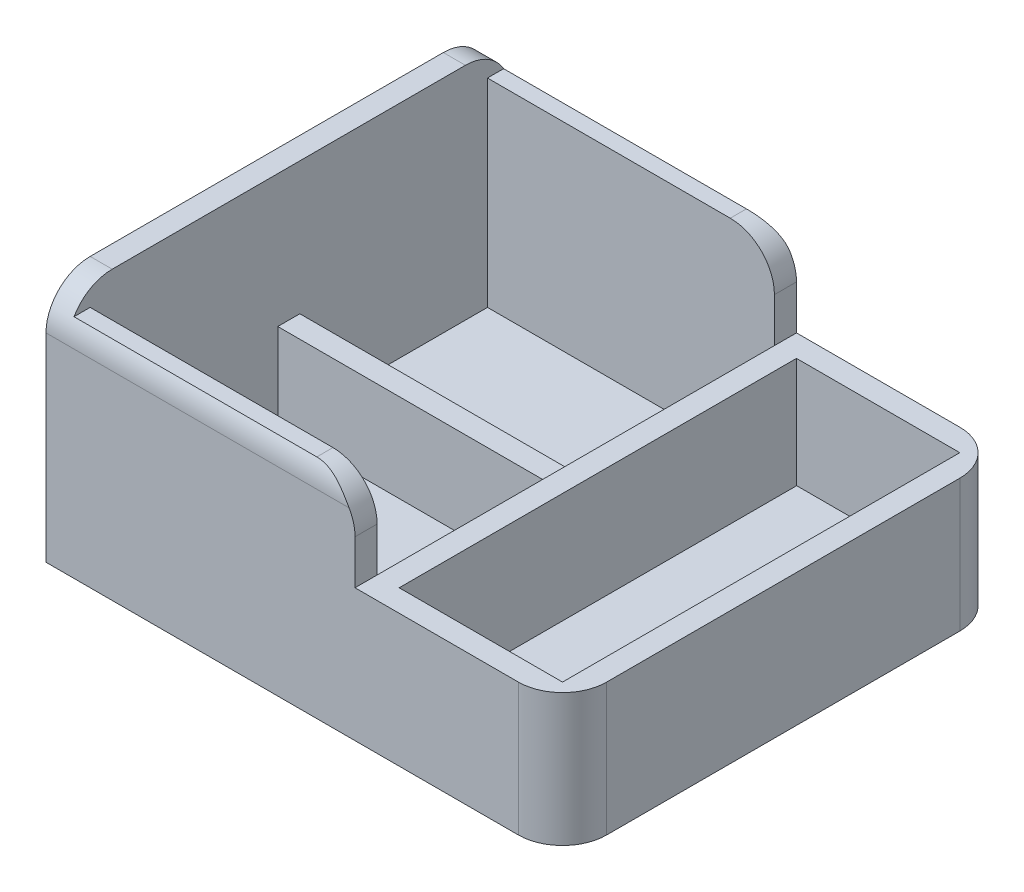
ISO-10303-21;
HEADER;
FILE_DESCRIPTION(('STEP AP214'),'2;1');
FILE_NAME('part.step','',(''),(''),'','','');
FILE_SCHEMA(('AUTOMOTIVE_DESIGN { 1 0 10303 214 1 1 1 1 }'));
ENDSEC;
DATA;
#1=APPLICATION_CONTEXT('core data for automotive mechanical design processes');
#2=APPLICATION_PROTOCOL_DEFINITION('international standard','automotive_design',2000,#1);
#3=PRODUCT_CONTEXT('',#1,'mechanical');
#4=PRODUCT('Part','Part','',(#3));
#5=PRODUCT_RELATED_PRODUCT_CATEGORY('part','',(#4));
#6=PRODUCT_DEFINITION_FORMATION('','',#4);
#7=PRODUCT_DEFINITION_CONTEXT('part definition',#1,'design');
#8=PRODUCT_DEFINITION('design','',#6,#7);
#9=PRODUCT_DEFINITION_SHAPE('','',#8);
#10=(LENGTH_UNIT() NAMED_UNIT(*) SI_UNIT(.MILLI.,.METRE.));
#11=(NAMED_UNIT(*) PLANE_ANGLE_UNIT() SI_UNIT($,.RADIAN.));
#12=(NAMED_UNIT(*) SI_UNIT($,.STERADIAN.) SOLID_ANGLE_UNIT());
#13=UNCERTAINTY_MEASURE_WITH_UNIT(LENGTH_MEASURE(1.E-05),#10,'distance_accuracy_value','');
#14=(GEOMETRIC_REPRESENTATION_CONTEXT(3) GLOBAL_UNCERTAINTY_ASSIGNED_CONTEXT((#13)) GLOBAL_UNIT_ASSIGNED_CONTEXT((#10,
#11,#12)) REPRESENTATION_CONTEXT('',''));
#15=CARTESIAN_POINT('',(0.,0.,0.));
#16=DIRECTION('',(0.,0.,1.));
#17=DIRECTION('',(1.,0.,0.));
#18=AXIS2_PLACEMENT_3D('',#15,#16,#17);
#19=CARTESIAN_POINT('',(0.,5.,0.));
#20=DIRECTION('',(0.,1.,0.));
#21=DIRECTION('',(0.,0.,1.));
#22=AXIS2_PLACEMENT_3D('',#19,#20,#21);
#23=PLANE('',#22);
#24=DIRECTION('',(-1.,0.,0.));
#25=VECTOR('',#24,1.);
#26=CARTESIAN_POINT('',(35.,5.,45.));
#27=LINE('',#26,#25);
#28=CARTESIAN_POINT('',(25.,5.,45.));
#29=VERTEX_POINT('',#28);
#30=CARTESIAN_POINT('',(-30.,5.,45.));
#31=VERTEX_POINT('',#30);
#32=EDGE_CURVE('E334',#29,#31,#27,.T.);
#33=ORIENTED_EDGE('',*,*,#32,.F.);
#34=DIRECTION('',(0.,0.,-1.));
#35=VECTOR('',#34,1.);
#36=CARTESIAN_POINT('',(25.,5.,2.5));
#37=LINE('',#36,#35);
#38=CARTESIAN_POINT('',(25.,5.,2.5));
#39=VERTEX_POINT('',#38);
#40=EDGE_CURVE('E467',#29,#39,#37,.T.);
#41=ORIENTED_EDGE('',*,*,#40,.T.);
#42=DIRECTION('',(1.,0.,0.));
#43=VECTOR('',#42,1.);
#44=CARTESIAN_POINT('',(35.,5.,2.5));
#45=LINE('',#44,#43);
#46=CARTESIAN_POINT('',(-30.,5.,2.5));
#47=VERTEX_POINT('',#46);
#48=EDGE_CURVE('E290',#47,#39,#45,.T.);
#49=ORIENTED_EDGE('',*,*,#48,.F.);
#50=DIRECTION('',(0.,0.,-1.));
#51=VECTOR('',#50,1.);
#52=CARTESIAN_POINT('',(-30.,5.,-50.));
#53=LINE('',#52,#51);
#54=EDGE_CURVE('E351',#31,#47,#53,.T.);
#55=ORIENTED_EDGE('',*,*,#54,.F.);
#56=EDGE_LOOP('',(#33,#41,#49,#55));
#57=FACE_BOUND('',#56,.T.);
#58=ADVANCED_FACE('F40',(#57),#23,.T.);
#59=CARTESIAN_POINT('',(35.,5.,50.));
#60=DIRECTION('',(-1.,0.,0.));
#61=DIRECTION('',(0.,0.,1.));
#62=AXIS2_PLACEMENT_3D('',#59,#60,#61);
#63=PLANE('',#62);
#64=DIRECTION('',(0.,-1.,0.));
#65=VECTOR('',#64,1.);
#66=CARTESIAN_POINT('',(35.,50.,45.));
#67=LINE('',#66,#65);
#68=CARTESIAN_POINT('',(35.,40.,45.));
#69=VERTEX_POINT('',#68);
#70=CARTESIAN_POINT('',(35.,30.,45.));
#71=VERTEX_POINT('',#70);
#72=EDGE_CURVE('E345',#69,#71,#67,.T.);
#73=ORIENTED_EDGE('',*,*,#72,.F.);
#74=DIRECTION('',(0.,0.,-1.));
#75=VECTOR('',#74,1.);
#76=CARTESIAN_POINT('',(35.,40.,50.));
#77=LINE('',#76,#75);
#78=CARTESIAN_POINT('',(35.,40.,50.));
#79=VERTEX_POINT('',#78);
#80=EDGE_CURVE('E378',#69,#79,#77,.F.);
#81=ORIENTED_EDGE('',*,*,#80,.T.);
#82=DIRECTION('',(0.,-1.,0.));
#83=VECTOR('',#82,1.);
#84=CARTESIAN_POINT('',(35.,5.,50.));
#85=LINE('',#84,#83);
#86=CARTESIAN_POINT('',(35.,30.,50.));
#87=VERTEX_POINT('',#86);
#88=EDGE_CURVE('E369',#79,#87,#85,.T.);
#89=ORIENTED_EDGE('',*,*,#88,.T.);
#90=DIRECTION('',(0.,0.,-1.));
#91=VECTOR('',#90,1.);
#92=CARTESIAN_POINT('',(35.,30.,50.));
#93=LINE('',#92,#91);
#94=EDGE_CURVE('E309',#87,#71,#93,.T.);
#95=ORIENTED_EDGE('',*,*,#94,.T.);
#96=EDGE_LOOP('',(#73,#81,#89,#95));
#97=FACE_BOUND('',#96,.T.);
#98=ADVANCED_FACE('F533',(#97),#63,.F.);
#99=DIRECTION('',(1.,0.,0.));
#100=VECTOR('',#99,1.);
#101=CARTESIAN_POINT('',(35.,5.,-2.5));
#102=LINE('',#101,#100);
#103=CARTESIAN_POINT('',(-30.,5.,-2.5));
#104=VERTEX_POINT('',#103);
#105=CARTESIAN_POINT('',(25.,5.,-2.5));
#106=VERTEX_POINT('',#105);
#107=EDGE_CURVE('E301',#104,#106,#102,.T.);
#108=ORIENTED_EDGE('',*,*,#107,.T.);
#109=DIRECTION('',(0.,0.,-1.));
#110=VECTOR('',#109,1.);
#111=CARTESIAN_POINT('',(25.,5.,-45.));
#112=LINE('',#111,#110);
#113=CARTESIAN_POINT('',(25.,5.,-45.));
#114=VERTEX_POINT('',#113);
#115=EDGE_CURVE('E478',#106,#114,#112,.T.);
#116=ORIENTED_EDGE('',*,*,#115,.T.);
#117=DIRECTION('',(1.,0.,0.));
#118=VECTOR('',#117,1.);
#119=CARTESIAN_POINT('',(35.,5.,-45.));
#120=LINE('',#119,#118);
#121=CARTESIAN_POINT('',(-30.,5.,-45.));
#122=VERTEX_POINT('',#121);
#123=EDGE_CURVE('E320',#122,#114,#120,.T.);
#124=ORIENTED_EDGE('',*,*,#123,.F.);
#125=EDGE_CURVE('E347',#104,#122,#53,.T.);
#126=ORIENTED_EDGE('',*,*,#125,.F.);
#127=EDGE_LOOP('',(#108,#116,#124,#126));
#128=FACE_BOUND('',#127,.T.);
#129=ADVANCED_FACE('F492',(#128),#23,.T.);
#130=CARTESIAN_POINT('',(-30.,55.,-50.));
#131=DIRECTION('',(-1.,0.,0.));
#132=DIRECTION('',(0.,0.,1.));
#133=AXIS2_PLACEMENT_3D('',#130,#131,#132);
#134=PLANE('',#133);
#135=DIRECTION('',(0.,0.,1.));
#136=VECTOR('',#135,1.);
#137=CARTESIAN_POINT('',(-30.,25.,-2.5));
#138=LINE('',#137,#136);
#139=CARTESIAN_POINT('',(-30.,25.,-2.5));
#140=VERTEX_POINT('',#139);
#141=CARTESIAN_POINT('',(-30.,25.,2.5));
#142=VERTEX_POINT('',#141);
#143=EDGE_CURVE('E304',#140,#142,#138,.T.);
#144=ORIENTED_EDGE('',*,*,#143,.F.);
#145=DIRECTION('',(0.,-1.,0.));
#146=VECTOR('',#145,1.);
#147=CARTESIAN_POINT('',(-30.,5.,-2.5));
#148=LINE('',#147,#146);
#149=EDGE_CURVE('E298',#140,#104,#148,.T.);
#150=ORIENTED_EDGE('',*,*,#149,.T.);
#151=ORIENTED_EDGE('',*,*,#125,.T.);
#152=DIRECTION('',(0.,-1.,0.));
#153=VECTOR('',#152,1.);
#154=CARTESIAN_POINT('',(-30.,50.,-45.));
#155=LINE('',#154,#153);
#156=CARTESIAN_POINT('',(-30.,50.,-45.));
#157=VERTEX_POINT('',#156);
#158=EDGE_CURVE('E331',#157,#122,#155,.T.);
#159=ORIENTED_EDGE('',*,*,#158,.F.);
#160=DIRECTION('',(0.,0.,1.));
#161=VECTOR('',#160,1.);
#162=CARTESIAN_POINT('',(-30.,50.,-50.));
#163=LINE('',#162,#161);
#164=CARTESIAN_POINT('',(-30.,50.,-48.6602540378444));
#165=VERTEX_POINT('',#164);
#166=EDGE_CURVE('E321',#165,#157,#163,.T.);
#167=ORIENTED_EDGE('',*,*,#166,.F.);
#168=CARTESIAN_POINT('',(-30.,45.,-40.));
#169=DIRECTION('',(-1.,0.,0.));
#170=DIRECTION('',(0.,0.,1.));
#171=AXIS2_PLACEMENT_3D('',#168,#169,#170);
#172=CIRCLE('',#171,10.);
#173=CARTESIAN_POINT('',(-30.,55.,-40.));
#174=VERTEX_POINT('',#173);
#175=EDGE_CURVE('E440',#165,#174,#172,.F.);
#176=ORIENTED_EDGE('',*,*,#175,.T.);
#177=DIRECTION('',(0.,0.,-1.));
#178=VECTOR('',#177,1.);
#179=CARTESIAN_POINT('',(-30.,55.,-50.));
#180=LINE('',#179,#178);
#181=CARTESIAN_POINT('',(-30.,55.,40.));
#182=VERTEX_POINT('',#181);
#183=EDGE_CURVE('E350',#182,#174,#180,.T.);
#184=ORIENTED_EDGE('',*,*,#183,.F.);
#185=CARTESIAN_POINT('',(-30.,45.,40.));
#186=DIRECTION('',(-1.,0.,0.));
#187=DIRECTION('',(0.,0.,1.));
#188=AXIS2_PLACEMENT_3D('',#185,#186,#187);
#189=CIRCLE('',#188,10.);
#190=CARTESIAN_POINT('',(-30.,50.,48.6602540378444));
#191=VERTEX_POINT('',#190);
#192=EDGE_CURVE('E395',#182,#191,#189,.F.);
#193=ORIENTED_EDGE('',*,*,#192,.T.);
#194=DIRECTION('',(0.,0.,1.));
#195=VECTOR('',#194,1.);
#196=CARTESIAN_POINT('',(-30.,50.,50.));
#197=LINE('',#196,#195);
#198=CARTESIAN_POINT('',(-30.,50.,45.));
#199=VERTEX_POINT('',#198);
#200=EDGE_CURVE('E337',#199,#191,#197,.T.);
#201=ORIENTED_EDGE('',*,*,#200,.F.);
#202=DIRECTION('',(0.,-1.,0.));
#203=VECTOR('',#202,1.);
#204=CARTESIAN_POINT('',(-30.,50.,45.));
#205=LINE('',#204,#203);
#206=EDGE_CURVE('E340',#199,#31,#205,.T.);
#207=ORIENTED_EDGE('',*,*,#206,.T.);
#208=ORIENTED_EDGE('',*,*,#54,.T.);
#209=DIRECTION('',(0.,-1.,0.));
#210=VECTOR('',#209,1.);
#211=CARTESIAN_POINT('',(-30.,5.,2.5));
#212=LINE('',#211,#210);
#213=EDGE_CURVE('E288',#142,#47,#212,.T.);
#214=ORIENTED_EDGE('',*,*,#213,.F.);
#215=EDGE_LOOP('',(#144,#150,#151,#159,#167,#176,#184,#193,#201,#207,#208,#214));
#216=FACE_BOUND('',#215,.T.);
#217=ADVANCED_FACE('F498',(#216),#134,.F.);
#218=CARTESIAN_POINT('',(-35.,5.,50.));
#219=DIRECTION('',(1.,0.,0.));
#220=DIRECTION('',(0.,0.,-1.));
#221=AXIS2_PLACEMENT_3D('',#218,#219,#220);
#222=PLANE('',#221);
#223=DIRECTION('',(0.,0.,1.));
#224=VECTOR('',#223,1.);
#225=CARTESIAN_POINT('',(-35.,55.,-50.));
#226=LINE('',#225,#224);
#227=CARTESIAN_POINT('',(-35.,55.,-40.));
#228=VERTEX_POINT('',#227);
#229=CARTESIAN_POINT('',(-35.,55.,40.));
#230=VERTEX_POINT('',#229);
#231=EDGE_CURVE('E348',#228,#230,#226,.T.);
#232=ORIENTED_EDGE('',*,*,#231,.F.);
#233=CARTESIAN_POINT('',(-35.,45.,-40.));
#234=DIRECTION('',(1.,0.,0.));
#235=DIRECTION('',(0.,0.,-1.));
#236=AXIS2_PLACEMENT_3D('',#233,#234,#235);
#237=CIRCLE('',#236,10.);
#238=CARTESIAN_POINT('',(-35.,45.,-50.));
#239=VERTEX_POINT('',#238);
#240=EDGE_CURVE('E593',#228,#239,#237,.F.);
#241=ORIENTED_EDGE('',*,*,#240,.T.);
#242=DIRECTION('',(0.,-1.,0.));
#243=VECTOR('',#242,1.);
#244=CARTESIAN_POINT('',(-35.,5.,-50.));
#245=LINE('',#244,#243);
#246=CARTESIAN_POINT('',(-35.,0.,-50.));
#247=VERTEX_POINT('',#246);
#248=EDGE_CURVE('E364',#239,#247,#245,.T.);
#249=ORIENTED_EDGE('',*,*,#248,.T.);
#250=DIRECTION('',(0.,0.,1.));
#251=VECTOR('',#250,1.);
#252=CARTESIAN_POINT('',(-35.,0.,50.));
#253=LINE('',#252,#251);
#254=CARTESIAN_POINT('',(-35.,0.,50.));
#255=VERTEX_POINT('',#254);
#256=EDGE_CURVE('E354',#247,#255,#253,.T.);
#257=ORIENTED_EDGE('',*,*,#256,.T.);
#258=DIRECTION('',(0.,-1.,0.));
#259=VECTOR('',#258,1.);
#260=CARTESIAN_POINT('',(-35.,5.,50.));
#261=LINE('',#260,#259);
#262=CARTESIAN_POINT('',(-35.,45.,50.));
#263=VERTEX_POINT('',#262);
#264=EDGE_CURVE('E372',#263,#255,#261,.T.);
#265=ORIENTED_EDGE('',*,*,#264,.F.);
#266=CARTESIAN_POINT('',(-35.,45.,40.));
#267=DIRECTION('',(1.,0.,0.));
#268=DIRECTION('',(0.,0.,-1.));
#269=AXIS2_PLACEMENT_3D('',#266,#267,#268);
#270=CIRCLE('',#269,10.);
#271=EDGE_CURVE('E590',#263,#230,#270,.F.);
#272=ORIENTED_EDGE('',*,*,#271,.T.);
#273=EDGE_LOOP('',(#232,#241,#249,#257,#265,#272));
#274=FACE_BOUND('',#273,.T.);
#275=ADVANCED_FACE('F595',(#274),#222,.F.);
#276=CARTESIAN_POINT('',(35.,5.,50.));
#277=DIRECTION('',(0.,0.,-1.));
#278=DIRECTION('',(-1.,0.,0.));
#279=AXIS2_PLACEMENT_3D('',#276,#277,#278);
#280=PLANE('',#279);
#281=DIRECTION('',(1.,0.,0.));
#282=VECTOR('',#281,1.);
#283=CARTESIAN_POINT('',(35.,0.,50.));
#284=LINE('',#283,#282);
#285=CARTESIAN_POINT('',(72.,0.,50.));
#286=VERTEX_POINT('',#285);
#287=EDGE_CURVE('E359',#255,#286,#284,.T.);
#288=ORIENTED_EDGE('',*,*,#287,.T.);
#289=DIRECTION('',(0.,-1.,0.));
#290=VECTOR('',#289,1.);
#291=CARTESIAN_POINT('',(72.,30.,50.));
#292=LINE('',#291,#290);
#293=CARTESIAN_POINT('',(72.,30.,50.));
#294=VERTEX_POINT('',#293);
#295=EDGE_CURVE('E463',#286,#294,#292,.F.);
#296=ORIENTED_EDGE('',*,*,#295,.T.);
#297=DIRECTION('',(-1.,0.,0.));
#298=VECTOR('',#297,1.);
#299=CARTESIAN_POINT('',(35.,30.,50.));
#300=LINE('',#299,#298);
#301=EDGE_CURVE('E318',#294,#87,#300,.T.);
#302=ORIENTED_EDGE('',*,*,#301,.T.);
#303=ORIENTED_EDGE('',*,*,#88,.F.);
#304=CARTESIAN_POINT('',(25.,40.,50.));
#305=DIRECTION('',(0.,0.,-1.));
#306=DIRECTION('',(-1.,0.,0.));
#307=AXIS2_PLACEMENT_3D('',#304,#305,#306);
#308=CIRCLE('',#307,10.);
#309=CARTESIAN_POINT('',(33.6602540378444,45.,50.));
#310=VERTEX_POINT('',#309);
#311=EDGE_CURVE('E380',#79,#310,#308,.F.);
#312=ORIENTED_EDGE('',*,*,#311,.T.);
#313=DIRECTION('',(1.,0.,0.));
#314=VECTOR('',#313,1.);
#315=CARTESIAN_POINT('',(-35.,45.,50.));
#316=LINE('',#315,#314);
#317=EDGE_CURVE('E407',#310,#263,#316,.F.);
#318=ORIENTED_EDGE('',*,*,#317,.T.);
#319=ORIENTED_EDGE('',*,*,#264,.T.);
#320=EDGE_LOOP('',(#288,#296,#302,#303,#312,#318,#319));
#321=FACE_BOUND('',#320,.T.);
#322=ADVANCED_FACE('F536',(#321),#280,.F.);
#323=DIRECTION('',(0.,-1.,0.));
#324=VECTOR('',#323,1.);
#325=CARTESIAN_POINT('',(35.,5.,-50.));
#326=LINE('',#325,#324);
#327=CARTESIAN_POINT('',(35.,40.,-50.));
#328=VERTEX_POINT('',#327);
#329=CARTESIAN_POINT('',(35.,30.,-50.));
#330=VERTEX_POINT('',#329);
#331=EDGE_CURVE('E367',#328,#330,#326,.T.);
#332=ORIENTED_EDGE('',*,*,#331,.F.);
#333=DIRECTION('',(0.,0.,-1.));
#334=VECTOR('',#333,1.);
#335=CARTESIAN_POINT('',(35.,40.,50.));
#336=LINE('',#335,#334);
#337=CARTESIAN_POINT('',(35.,40.,-45.));
#338=VERTEX_POINT('',#337);
#339=EDGE_CURVE('E388',#328,#338,#336,.F.);
#340=ORIENTED_EDGE('',*,*,#339,.T.);
#341=DIRECTION('',(0.,-1.,0.));
#342=VECTOR('',#341,1.);
#343=CARTESIAN_POINT('',(35.,50.,-45.));
#344=LINE('',#343,#342);
#345=CARTESIAN_POINT('',(35.,30.,-45.));
#346=VERTEX_POINT('',#345);
#347=EDGE_CURVE('E329',#338,#346,#344,.T.);
#348=ORIENTED_EDGE('',*,*,#347,.T.);
#349=EDGE_CURVE('E313',#346,#330,#93,.T.);
#350=ORIENTED_EDGE('',*,*,#349,.T.);
#351=EDGE_LOOP('',(#332,#340,#348,#350));
#352=FACE_BOUND('',#351,.T.);
#353=ADVANCED_FACE('F566',(#352),#63,.F.);
#354=CARTESIAN_POINT('',(35.,5.,-50.));
#355=DIRECTION('',(0.,0.,1.));
#356=DIRECTION('',(1.,0.,0.));
#357=AXIS2_PLACEMENT_3D('',#354,#355,#356);
#358=PLANE('',#357);
#359=DIRECTION('',(1.,0.,0.));
#360=VECTOR('',#359,1.);
#361=CARTESIAN_POINT('',(35.,30.,-50.));
#362=LINE('',#361,#360);
#363=CARTESIAN_POINT('',(72.,30.,-50.));
#364=VERTEX_POINT('',#363);
#365=EDGE_CURVE('E312',#330,#364,#362,.T.);
#366=ORIENTED_EDGE('',*,*,#365,.T.);
#367=DIRECTION('',(0.,-1.,0.));
#368=VECTOR('',#367,1.);
#369=CARTESIAN_POINT('',(72.,0.,-50.));
#370=LINE('',#369,#368);
#371=CARTESIAN_POINT('',(72.,0.,-50.));
#372=VERTEX_POINT('',#371);
#373=EDGE_CURVE('E449',#364,#372,#370,.T.);
#374=ORIENTED_EDGE('',*,*,#373,.T.);
#375=DIRECTION('',(-1.,0.,0.));
#376=VECTOR('',#375,1.);
#377=CARTESIAN_POINT('',(35.,0.,-50.));
#378=LINE('',#377,#376);
#379=EDGE_CURVE('E362',#372,#247,#378,.T.);
#380=ORIENTED_EDGE('',*,*,#379,.T.);
#381=ORIENTED_EDGE('',*,*,#248,.F.);
#382=DIRECTION('',(-1.,0.,0.));
#383=VECTOR('',#382,1.);
#384=CARTESIAN_POINT('',(-30.,45.,-50.));
#385=LINE('',#384,#383);
#386=CARTESIAN_POINT('',(33.6602540378444,45.,-50.));
#387=VERTEX_POINT('',#386);
#388=EDGE_CURVE('E437',#239,#387,#385,.F.);
#389=ORIENTED_EDGE('',*,*,#388,.T.);
#390=CARTESIAN_POINT('',(25.,40.,-50.));
#391=DIRECTION('',(0.,0.,1.));
#392=DIRECTION('',(1.,0.,0.));
#393=AXIS2_PLACEMENT_3D('',#390,#391,#392);
#394=CIRCLE('',#393,10.);
#395=EDGE_CURVE('E386',#387,#328,#394,.F.);
#396=ORIENTED_EDGE('',*,*,#395,.T.);
#397=ORIENTED_EDGE('',*,*,#331,.T.);
#398=EDGE_LOOP('',(#366,#374,#380,#381,#389,#396,#397));
#399=FACE_BOUND('',#398,.T.);
#400=ADVANCED_FACE('F559',(#399),#358,.F.);
#401=CARTESIAN_POINT('',(0.,0.,0.));
#402=DIRECTION('',(0.,1.,0.));
#403=DIRECTION('',(0.,0.,1.));
#404=AXIS2_PLACEMENT_3D('',#401,#402,#403);
#405=PLANE('',#404);
#406=DIRECTION('',(0.,0.,1.));
#407=VECTOR('',#406,1.);
#408=CARTESIAN_POINT('',(82.,0.,-50.));
#409=LINE('',#408,#407);
#410=CARTESIAN_POINT('',(82.,0.,-40.));
#411=VERTEX_POINT('',#410);
#412=CARTESIAN_POINT('',(82.,0.,40.));
#413=VERTEX_POINT('',#412);
#414=EDGE_CURVE('E264',#411,#413,#409,.T.);
#415=ORIENTED_EDGE('',*,*,#414,.T.);
#416=CARTESIAN_POINT('',(72.,0.,40.));
#417=DIRECTION('',(0.,1.,0.));
#418=DIRECTION('',(0.,0.,1.));
#419=AXIS2_PLACEMENT_3D('',#416,#417,#418);
#420=CIRCLE('',#419,10.);
#421=EDGE_CURVE('E461',#413,#286,#420,.F.);
#422=ORIENTED_EDGE('',*,*,#421,.T.);
#423=ORIENTED_EDGE('',*,*,#287,.F.);
#424=ORIENTED_EDGE('',*,*,#256,.F.);
#425=ORIENTED_EDGE('',*,*,#379,.F.);
#426=CARTESIAN_POINT('',(72.,0.,-40.));
#427=DIRECTION('',(0.,1.,0.));
#428=DIRECTION('',(0.,0.,1.));
#429=AXIS2_PLACEMENT_3D('',#426,#427,#428);
#430=CIRCLE('',#429,10.);
#431=EDGE_CURVE('E452',#372,#411,#430,.F.);
#432=ORIENTED_EDGE('',*,*,#431,.T.);
#433=EDGE_LOOP('',(#415,#422,#423,#424,#425,#432));
#434=FACE_BOUND('',#433,.T.);
#435=ADVANCED_FACE('F550',(#434),#405,.F.);
#436=CARTESIAN_POINT('',(0.,55.,0.));
#437=DIRECTION('',(0.,1.,0.));
#438=DIRECTION('',(0.,0.,1.));
#439=AXIS2_PLACEMENT_3D('',#436,#437,#438);
#440=PLANE('',#439);
#441=ORIENTED_EDGE('',*,*,#183,.T.);
#442=DIRECTION('',(-1.,0.,0.));
#443=VECTOR('',#442,1.);
#444=CARTESIAN_POINT('',(-35.,55.,-40.));
#445=LINE('',#444,#443);
#446=EDGE_CURVE('E582',#174,#228,#445,.T.);
#447=ORIENTED_EDGE('',*,*,#446,.T.);
#448=ORIENTED_EDGE('',*,*,#231,.T.);
#449=DIRECTION('',(1.,0.,0.));
#450=VECTOR('',#449,1.);
#451=CARTESIAN_POINT('',(-30.,55.,40.));
#452=LINE('',#451,#450);
#453=EDGE_CURVE('E392',#230,#182,#452,.T.);
#454=ORIENTED_EDGE('',*,*,#453,.T.);
#455=EDGE_LOOP('',(#441,#447,#448,#454));
#456=FACE_BOUND('',#455,.T.);
#457=ADVANCED_FACE('F585',(#456),#440,.T.);
#458=CARTESIAN_POINT('',(35.,50.,45.));
#459=DIRECTION('',(0.,0.,1.));
#460=DIRECTION('',(1.,0.,0.));
#461=AXIS2_PLACEMENT_3D('',#458,#459,#460);
#462=PLANE('',#461);
#463=CARTESIAN_POINT('',(35.,15.,45.));
#464=VERTEX_POINT('',#463);
#465=EDGE_CURVE('E344',#71,#464,#67,.T.);
#466=ORIENTED_EDGE('',*,*,#465,.T.);
#467=CARTESIAN_POINT('',(25.,15.,45.));
#468=DIRECTION('',(0.,0.,1.));
#469=DIRECTION('',(1.,0.,0.));
#470=AXIS2_PLACEMENT_3D('',#467,#468,#469);
#471=CIRCLE('',#470,10.);
#472=EDGE_CURVE('E476',#464,#29,#471,.F.);
#473=ORIENTED_EDGE('',*,*,#472,.T.);
#474=ORIENTED_EDGE('',*,*,#32,.T.);
#475=ORIENTED_EDGE('',*,*,#206,.F.);
#476=DIRECTION('',(-1.,0.,0.));
#477=VECTOR('',#476,1.);
#478=CARTESIAN_POINT('',(35.,50.,45.));
#479=LINE('',#478,#477);
#480=CARTESIAN_POINT('',(25.,50.,45.));
#481=VERTEX_POINT('',#480);
#482=EDGE_CURVE('E335',#481,#199,#479,.T.);
#483=ORIENTED_EDGE('',*,*,#482,.F.);
#484=CARTESIAN_POINT('',(25.,40.,45.));
#485=DIRECTION('',(0.,0.,1.));
#486=DIRECTION('',(1.,0.,0.));
#487=AXIS2_PLACEMENT_3D('',#484,#485,#486);
#488=CIRCLE('',#487,10.);
#489=EDGE_CURVE('E376',#481,#69,#488,.F.);
#490=ORIENTED_EDGE('',*,*,#489,.T.);
#491=ORIENTED_EDGE('',*,*,#72,.T.);
#492=EDGE_LOOP('',(#466,#473,#474,#475,#483,#490,#491));
#493=FACE_BOUND('',#492,.T.);
#494=ADVANCED_FACE('F515',(#493),#462,.F.);
#495=CARTESIAN_POINT('',(0.,50.,0.));
#496=DIRECTION('',(0.,1.,0.));
#497=DIRECTION('',(0.,0.,1.));
#498=AXIS2_PLACEMENT_3D('',#495,#496,#497);
#499=PLANE('',#498);
#500=ORIENTED_EDGE('',*,*,#200,.T.);
#501=DIRECTION('',(-1.,0.,0.));
#502=VECTOR('',#501,1.);
#503=CARTESIAN_POINT('',(-30.,50.,48.6602540378444));
#504=LINE('',#503,#502);
#505=CARTESIAN_POINT('',(25.,50.,48.6602540378444));
#506=VERTEX_POINT('',#505);
#507=EDGE_CURVE('E397',#191,#506,#504,.F.);
#508=ORIENTED_EDGE('',*,*,#507,.T.);
#509=DIRECTION('',(0.,0.,-1.));
#510=VECTOR('',#509,1.);
#511=CARTESIAN_POINT('',(25.,50.,45.));
#512=LINE('',#511,#510);
#513=EDGE_CURVE('E374',#506,#481,#512,.T.);
#514=ORIENTED_EDGE('',*,*,#513,.T.);
#515=ORIENTED_EDGE('',*,*,#482,.T.);
#516=EDGE_LOOP('',(#500,#508,#514,#515));
#517=FACE_BOUND('',#516,.T.);
#518=ADVANCED_FACE('F524',(#517),#499,.T.);
#519=CARTESIAN_POINT('',(35.,50.,-45.));
#520=DIRECTION('',(0.,0.,-1.));
#521=DIRECTION('',(-1.,0.,0.));
#522=AXIS2_PLACEMENT_3D('',#519,#520,#521);
#523=PLANE('',#522);
#524=ORIENTED_EDGE('',*,*,#123,.T.);
#525=CARTESIAN_POINT('',(25.,15.,-45.));
#526=DIRECTION('',(0.,0.,-1.));
#527=DIRECTION('',(-1.,0.,0.));
#528=AXIS2_PLACEMENT_3D('',#525,#526,#527);
#529=CIRCLE('',#528,10.);
#530=CARTESIAN_POINT('',(35.,15.,-45.));
#531=VERTEX_POINT('',#530);
#532=EDGE_CURVE('E48',#114,#531,#529,.F.);
#533=ORIENTED_EDGE('',*,*,#532,.T.);
#534=EDGE_CURVE('E326',#346,#531,#344,.T.);
#535=ORIENTED_EDGE('',*,*,#534,.F.);
#536=ORIENTED_EDGE('',*,*,#347,.F.);
#537=CARTESIAN_POINT('',(25.,40.,-45.));
#538=DIRECTION('',(0.,0.,-1.));
#539=DIRECTION('',(-1.,0.,0.));
#540=AXIS2_PLACEMENT_3D('',#537,#538,#539);
#541=CIRCLE('',#540,10.);
#542=CARTESIAN_POINT('',(25.,50.,-45.));
#543=VERTEX_POINT('',#542);
#544=EDGE_CURVE('E390',#338,#543,#541,.F.);
#545=ORIENTED_EDGE('',*,*,#544,.T.);
#546=DIRECTION('',(1.,0.,0.));
#547=VECTOR('',#546,1.);
#548=CARTESIAN_POINT('',(35.,50.,-45.));
#549=LINE('',#548,#547);
#550=EDGE_CURVE('E323',#157,#543,#549,.T.);
#551=ORIENTED_EDGE('',*,*,#550,.F.);
#552=ORIENTED_EDGE('',*,*,#158,.T.);
#553=EDGE_LOOP('',(#524,#533,#535,#536,#545,#551,#552));
#554=FACE_BOUND('',#553,.T.);
#555=ADVANCED_FACE('F482',(#554),#523,.F.);
#556=CARTESIAN_POINT('',(0.,50.,0.));
#557=DIRECTION('',(0.,-1.,0.));
#558=DIRECTION('',(0.,0.,-1.));
#559=AXIS2_PLACEMENT_3D('',#556,#557,#558);
#560=PLANE('',#559);
#561=DIRECTION('',(0.,0.,-1.));
#562=VECTOR('',#561,1.);
#563=CARTESIAN_POINT('',(25.,50.,0.));
#564=LINE('',#563,#562);
#565=CARTESIAN_POINT('',(25.,50.,-48.6602540378444));
#566=VERTEX_POINT('',#565);
#567=EDGE_CURVE('E383',#543,#566,#564,.T.);
#568=ORIENTED_EDGE('',*,*,#567,.T.);
#569=DIRECTION('',(1.,0.,0.));
#570=VECTOR('',#569,1.);
#571=CARTESIAN_POINT('',(25.,50.,-48.6602540378444));
#572=LINE('',#571,#570);
#573=EDGE_CURVE('E436',#566,#165,#572,.F.);
#574=ORIENTED_EDGE('',*,*,#573,.T.);
#575=ORIENTED_EDGE('',*,*,#166,.T.);
#576=ORIENTED_EDGE('',*,*,#550,.T.);
#577=EDGE_LOOP('',(#568,#574,#575,#576));
#578=FACE_BOUND('',#577,.T.);
#579=ADVANCED_FACE('F576',(#578),#560,.F.);
#580=CARTESIAN_POINT('',(35.,30.,50.));
#581=DIRECTION('',(-1.,0.,0.));
#582=DIRECTION('',(0.,0.,1.));
#583=AXIS2_PLACEMENT_3D('',#580,#581,#582);
#584=PLANE('',#583);
#585=DIRECTION('',(0.,1.,0.));
#586=VECTOR('',#585,1.);
#587=CARTESIAN_POINT('',(35.,25.,2.5));
#588=LINE('',#587,#586);
#589=CARTESIAN_POINT('',(35.,15.,2.5));
#590=VERTEX_POINT('',#589);
#591=CARTESIAN_POINT('',(35.,25.,2.5));
#592=VERTEX_POINT('',#591);
#593=EDGE_CURVE('E283',#590,#592,#588,.T.);
#594=ORIENTED_EDGE('',*,*,#593,.F.);
#595=DIRECTION('',(0.,0.,-1.));
#596=VECTOR('',#595,1.);
#597=CARTESIAN_POINT('',(35.,15.,45.));
#598=LINE('',#597,#596);
#599=EDGE_CURVE('E474',#590,#464,#598,.F.);
#600=ORIENTED_EDGE('',*,*,#599,.T.);
#601=ORIENTED_EDGE('',*,*,#465,.F.);
#602=EDGE_CURVE('E306',#71,#346,#93,.T.);
#603=ORIENTED_EDGE('',*,*,#602,.T.);
#604=ORIENTED_EDGE('',*,*,#534,.T.);
#605=DIRECTION('',(0.,0.,-1.));
#606=VECTOR('',#605,1.);
#607=CARTESIAN_POINT('',(35.,15.,-2.5));
#608=LINE('',#607,#606);
#609=CARTESIAN_POINT('',(35.,15.,-2.5));
#610=VERTEX_POINT('',#609);
#611=EDGE_CURVE('E472',#531,#610,#608,.F.);
#612=ORIENTED_EDGE('',*,*,#611,.T.);
#613=DIRECTION('',(0.,1.,0.));
#614=VECTOR('',#613,1.);
#615=CARTESIAN_POINT('',(35.,25.,-2.5));
#616=LINE('',#615,#614);
#617=CARTESIAN_POINT('',(35.,25.,-2.5));
#618=VERTEX_POINT('',#617);
#619=EDGE_CURVE('E293',#610,#618,#616,.T.);
#620=ORIENTED_EDGE('',*,*,#619,.T.);
#621=DIRECTION('',(0.,0.,1.));
#622=VECTOR('',#621,1.);
#623=CARTESIAN_POINT('',(35.,25.,-2.5));
#624=LINE('',#623,#622);
#625=EDGE_CURVE('E303',#618,#592,#624,.T.);
#626=ORIENTED_EDGE('',*,*,#625,.T.);
#627=EDGE_LOOP('',(#594,#600,#601,#603,#604,#612,#620,#626));
#628=FACE_BOUND('',#627,.T.);
#629=ADVANCED_FACE('F488',(#628),#584,.T.);
#630=CARTESIAN_POINT('',(40.,30.,50.));
#631=DIRECTION('',(1.,0.,0.));
#632=DIRECTION('',(0.,0.,-1.));
#633=AXIS2_PLACEMENT_3D('',#630,#631,#632);
#634=PLANE('',#633);
#635=DIRECTION('',(0.,1.,0.));
#636=VECTOR('',#635,1.);
#637=CARTESIAN_POINT('',(40.,30.,45.));
#638=LINE('',#637,#636);
#639=CARTESIAN_POINT('',(40.,5.00000000000001,45.));
#640=VERTEX_POINT('',#639);
#641=CARTESIAN_POINT('',(40.,30.,45.));
#642=VERTEX_POINT('',#641);
#643=EDGE_CURVE('E253',#640,#642,#638,.T.);
#644=ORIENTED_EDGE('',*,*,#643,.F.);
#645=DIRECTION('',(0.,0.,1.));
#646=VECTOR('',#645,1.);
#647=CARTESIAN_POINT('',(40.,5.00000000000001,45.));
#648=LINE('',#647,#646);
#649=CARTESIAN_POINT('',(40.,5.00000000000001,-45.0445444611139));
#650=VERTEX_POINT('',#649);
#651=EDGE_CURVE('E275',#650,#640,#648,.T.);
#652=ORIENTED_EDGE('',*,*,#651,.F.);
#653=DIRECTION('',(0.,-0.999998412636567,-0.00178177561622596));
#654=VECTOR('',#653,1.);
#655=CARTESIAN_POINT('',(40.,5.00000000000001,-45.0445444611139));
#656=LINE('',#655,#654);
#657=CARTESIAN_POINT('',(40.,30.,-45.));
#658=VERTEX_POINT('',#657);
#659=EDGE_CURVE('E267',#658,#650,#656,.T.);
#660=ORIENTED_EDGE('',*,*,#659,.F.);
#661=DIRECTION('',(0.,0.,1.));
#662=VECTOR('',#661,1.);
#663=CARTESIAN_POINT('',(40.,30.,50.));
#664=LINE('',#663,#662);
#665=EDGE_CURVE('E316',#658,#642,#664,.T.);
#666=ORIENTED_EDGE('',*,*,#665,.T.);
#667=EDGE_LOOP('',(#644,#652,#660,#666));
#668=FACE_BOUND('',#667,.T.);
#669=ADVANCED_FACE('F643',(#668),#634,.T.);
#670=CARTESIAN_POINT('',(0.,30.,0.));
#671=DIRECTION('',(0.,-1.,0.));
#672=DIRECTION('',(0.,0.,-1.));
#673=AXIS2_PLACEMENT_3D('',#670,#671,#672);
#674=PLANE('',#673);
#675=DIRECTION('',(-1.,0.,0.));
#676=VECTOR('',#675,1.);
#677=CARTESIAN_POINT('',(77.,30.,-45.));
#678=LINE('',#677,#676);
#679=CARTESIAN_POINT('',(77.,30.,-45.));
#680=VERTEX_POINT('',#679);
#681=EDGE_CURVE('E261',#680,#658,#678,.T.);
#682=ORIENTED_EDGE('',*,*,#681,.F.);
#683=DIRECTION('',(0.,0.,-1.));
#684=VECTOR('',#683,1.);
#685=CARTESIAN_POINT('',(77.,30.,-50.));
#686=LINE('',#685,#684);
#687=CARTESIAN_POINT('',(77.,30.,45.));
#688=VERTEX_POINT('',#687);
#689=EDGE_CURVE('E242',#688,#680,#686,.T.);
#690=ORIENTED_EDGE('',*,*,#689,.F.);
#691=DIRECTION('',(-1.,0.,0.));
#692=VECTOR('',#691,1.);
#693=CARTESIAN_POINT('',(77.,30.,45.));
#694=LINE('',#693,#692);
#695=EDGE_CURVE('E246',#688,#642,#694,.T.);
#696=ORIENTED_EDGE('',*,*,#695,.T.);
#697=ORIENTED_EDGE('',*,*,#665,.F.);
#698=EDGE_LOOP('',(#682,#690,#696,#697));
#699=FACE_BOUND('',#698,.T.);
#700=ORIENTED_EDGE('',*,*,#301,.F.);
#701=CARTESIAN_POINT('',(72.,30.,40.));
#702=DIRECTION('',(0.,-1.,0.));
#703=DIRECTION('',(0.,0.,-1.));
#704=AXIS2_PLACEMENT_3D('',#701,#702,#703);
#705=CIRCLE('',#704,10.);
#706=CARTESIAN_POINT('',(82.,30.,40.));
#707=VERTEX_POINT('',#706);
#708=EDGE_CURVE('E465',#294,#707,#705,.F.);
#709=ORIENTED_EDGE('',*,*,#708,.T.);
#710=DIRECTION('',(0.,0.,1.));
#711=VECTOR('',#710,1.);
#712=CARTESIAN_POINT('',(82.,30.,-50.));
#713=LINE('',#712,#711);
#714=CARTESIAN_POINT('',(82.,30.,-40.));
#715=VERTEX_POINT('',#714);
#716=EDGE_CURVE('E263',#715,#707,#713,.T.);
#717=ORIENTED_EDGE('',*,*,#716,.F.);
#718=CARTESIAN_POINT('',(72.,30.,-40.));
#719=DIRECTION('',(0.,-1.,0.));
#720=DIRECTION('',(0.,0.,-1.));
#721=AXIS2_PLACEMENT_3D('',#718,#719,#720);
#722=CIRCLE('',#721,10.);
#723=EDGE_CURVE('E456',#715,#364,#722,.F.);
#724=ORIENTED_EDGE('',*,*,#723,.T.);
#725=ORIENTED_EDGE('',*,*,#365,.F.);
#726=ORIENTED_EDGE('',*,*,#349,.F.);
#727=ORIENTED_EDGE('',*,*,#602,.F.);
#728=ORIENTED_EDGE('',*,*,#94,.F.);
#729=EDGE_LOOP('',(#700,#709,#717,#724,#725,#726,#727,#728));
#730=FACE_BOUND('',#729,.T.);
#731=ADVANCED_FACE('F258',(#699,#730),#674,.F.);
#732=CARTESIAN_POINT('',(25.,40.,0.));
#733=DIRECTION('',(0.,0.,1.));
#734=DIRECTION('',(1.,0.,0.));
#735=AXIS2_PLACEMENT_3D('',#732,#733,#734);
#736=CYLINDRICAL_SURFACE('',#735,10.);
#737=ORIENTED_EDGE('',*,*,#513,.F.);
#738=CARTESIAN_POINT('',(25.,50.,48.6602540378444));
#739=CARTESIAN_POINT('',(25.133882863324,50.0000011081324,48.6602480335757));
#740=CARTESIAN_POINT('',(25.2677458934794,49.9973107201766,48.6618073227925));
#741=CARTESIAN_POINT('',(25.5351766029213,49.9865656671716,48.6679997242933));
#742=CARTESIAN_POINT('',(25.668744301225,49.978511358246,48.6726326325124));
#743=CARTESIAN_POINT('',(26.0683510999899,49.9463539418758,48.6910433066923));
#744=CARTESIAN_POINT('',(26.3335927800706,49.9142562516303,48.7093332683052));
#745=CARTESIAN_POINT('',(26.8578766862922,49.8294649082822,48.756630731459));
#746=CARTESIAN_POINT('',(27.1169486371126,49.7769114472016,48.7855652091291));
#747=CARTESIAN_POINT('',(27.6290687674222,49.6518126178842,48.852438150126));
#748=CARTESIAN_POINT('',(27.8821158148005,49.5792635240728,48.8903782911999));
#749=CARTESIAN_POINT('',(28.3798694133709,49.4151446432451,48.973009458308));
#750=CARTESIAN_POINT('',(28.6246003513802,49.3236373030371,49.0176781923126));
#751=CARTESIAN_POINT('',(29.1054109205081,49.1221461104319,49.1115452478006));
#752=CARTESIAN_POINT('',(29.341490716914,49.0121626112616,49.160743482681));
#753=CARTESIAN_POINT('',(29.8047048011207,48.7739867240968,49.2614137919315));
#754=CARTESIAN_POINT('',(30.0318098241901,48.6457401857398,49.312892302907));
#755=CARTESIAN_POINT('',(30.4753723638485,48.3718719401589,49.4155117949228));
#756=CARTESIAN_POINT('',(30.6918296289168,48.2262498227679,49.4666527679652));
#757=CARTESIAN_POINT('',(31.1318769701339,47.9044817012274,49.5705302603713));
#758=CARTESIAN_POINT('',(31.3543900731728,47.7267729506663,49.6230043568098));
#759=CARTESIAN_POINT('',(31.7843350611387,47.3521494857015,49.7213629599576));
#760=CARTESIAN_POINT('',(31.9917628370714,47.1552295724396,49.7672456745779));
#761=CARTESIAN_POINT('',(32.3891483150538,46.7440292419432,49.8489665308996));
#762=CARTESIAN_POINT('',(32.5791698787027,46.5298181968536,49.8848424665759));
#763=CARTESIAN_POINT('',(32.9407903347631,46.0848889023565,49.9435035801834));
#764=CARTESIAN_POINT('',(33.1124064072228,45.8541863876794,49.9663010538155));
#765=CARTESIAN_POINT('',(33.3419763171624,45.5159896708965,49.9871848562621));
#766=CARTESIAN_POINT('',(33.4082375402092,45.4144485430242,49.9919368770503));
#767=CARTESIAN_POINT('',(33.537049976741,45.208979857048,49.9983441878657));
#768=CARTESIAN_POINT('',(33.5996020901216,45.10505288635,50.0000002320328));
#769=CARTESIAN_POINT('',(33.6602540378444,45.,50.));
#770=B_SPLINE_CURVE_WITH_KNOTS('',3,(#738,#739,#740,#741,#742,#743,#744,#745,#746,#747,#748,
#749,#750,#751,#752,#753,#754,#755,#756,#757,#758,#759,#760,#761,#762,#763,#764,#765,#766,#767,
#768,#769),.UNSPECIFIED.,.F.,.F.,(4,2,2,2,2,2,2,2,2,2,2,2,2,2,2,4),(0.,0.401573544824952,
0.803120430887491,1.60532103187978,2.40211796287801,3.19906345309622,3.99342446145004,
4.78777028495379,5.58452239565039,6.38129331815498,7.24890664856508,8.11675542422383,
8.98128066948362,9.8449917946963,10.2089158883287,10.5727513232019),.UNSPECIFIED.);
#771=EDGE_CURVE('E399',#506,#310,#770,.T.);
#772=ORIENTED_EDGE('',*,*,#771,.T.);
#773=ORIENTED_EDGE('',*,*,#311,.F.);
#774=ORIENTED_EDGE('',*,*,#80,.F.);
#775=ORIENTED_EDGE('',*,*,#489,.F.);
#776=EDGE_LOOP('',(#737,#772,#773,#774,#775));
#777=FACE_BOUND('',#776,.T.);
#778=ADVANCED_FACE('F409',(#777),#736,.T.);
#779=CARTESIAN_POINT('',(25.,40.,0.));
#780=DIRECTION('',(0.,0.,-1.));
#781=DIRECTION('',(-1.,0.,0.));
#782=AXIS2_PLACEMENT_3D('',#779,#780,#781);
#783=CYLINDRICAL_SURFACE('',#782,10.);
#784=ORIENTED_EDGE('',*,*,#395,.F.);
#785=CARTESIAN_POINT('',(33.6602540378444,45.,-50.));
#786=CARTESIAN_POINT('',(33.5934005809702,45.1157970985213,-50.0000011316083));
#787=CARTESIAN_POINT('',(33.5242350122104,45.2302273001059,-49.9979883903084));
#788=CARTESIAN_POINT('',(33.3814468109129,45.4561154838935,-49.9902314800259));
#789=CARTESIAN_POINT('',(33.3078249801182,45.5675739955773,-49.9844879804595));
#790=CARTESIAN_POINT('',(33.080715882538,45.8968664085795,-49.9621268888509));
#791=CARTESIAN_POINT('',(32.920783487902,46.1099658971709,-49.9403769164336));
#792=CARTESIAN_POINT('',(32.5863121065378,46.5205522335936,-49.8858777868651));
#793=CARTESIAN_POINT('',(32.4118694494047,46.7181273917064,-49.8531974031879));
#794=CARTESIAN_POINT('',(32.0487848815704,47.0981483844971,-49.7793276308981));
#795=CARTESIAN_POINT('',(31.8601384650901,47.2805893793462,-49.7381355348723));
#796=CARTESIAN_POINT('',(31.4708346330204,47.6286412391238,-49.6499911249416));
#797=CARTESIAN_POINT('',(31.2702377133514,47.7943270406619,-49.6030667391472));
#798=CARTESIAN_POINT('',(30.8573193465504,48.1092058925826,-49.5057872010658));
#799=CARTESIAN_POINT('',(30.644998849949,48.2584002771295,-49.4554323268406));
#800=CARTESIAN_POINT('',(30.2090003302516,48.5401324646495,-49.3536067962267));
#801=CARTESIAN_POINT('',(29.9852934426278,48.6726246395379,-49.3021335152401));
#802=CARTESIAN_POINT('',(29.5279851654942,48.9199172496914,-49.200658373068));
#803=CARTESIAN_POINT('',(29.2943837198016,49.0347175844825,-49.1506565202402));
#804=CARTESIAN_POINT('',(28.7948639164856,49.2563929386793,-49.0498274915881));
#805=CARTESIAN_POINT('',(28.528024124779,49.3613839671349,-48.9994010586433));
#806=CARTESIAN_POINT('',(27.9850039102987,49.5484141758912,-48.9063381626428));
#807=CARTESIAN_POINT('',(27.7088214968152,49.6304484296309,-48.8637033723662));
#808=CARTESIAN_POINT('',(27.1499603110168,49.7703824867815,-48.7891824555712));
#809=CARTESIAN_POINT('',(26.8673061483873,49.8283615055033,-48.7572611164657));
#810=CARTESIAN_POINT('',(26.2970568359517,49.9197221250059,-48.7062684656281));
#811=CARTESIAN_POINT('',(26.0094659951646,49.953124161831,-48.6871864789582));
#812=CARTESIAN_POINT('',(25.600878987815,49.9826562617592,-48.6702484170433));
#813=CARTESIAN_POINT('',(25.4807870592232,49.989160038167,-48.66650513878));
#814=CARTESIAN_POINT('',(25.2404698357935,49.9978304433348,-48.6615074745453));
#815=CARTESIAN_POINT('',(25.1202446700427,49.9999997622537,-48.6602515448179));
#816=CARTESIAN_POINT('',(25.,50.,-48.6602540378444));
#817=B_SPLINE_CURVE_WITH_KNOTS('',3,(#785,#786,#787,#788,#789,#790,#791,#792,#793,#794,#795,
#796,#797,#798,#799,#800,#801,#802,#803,#804,#805,#806,#807,#808,#809,#810,#811,#812,#813,#814,
#815,#816),.UNSPECIFIED.,.F.,.F.,(4,2,2,2,2,2,2,2,2,2,2,2,2,2,2,4),(0.,0.401037549634166,
0.802003160304176,1.60273118186388,2.39851299041826,3.19454831268918,3.98684937154812,
4.77908628584128,5.57344262223615,6.36780346970286,7.24013607900366,8.11265574898533,
8.98227890702135,9.85117814365226,10.2120714885406,10.5727407771422),.UNSPECIFIED.);
#818=EDGE_CURVE('E429',#387,#566,#817,.T.);
#819=ORIENTED_EDGE('',*,*,#818,.T.);
#820=ORIENTED_EDGE('',*,*,#567,.F.);
#821=ORIENTED_EDGE('',*,*,#544,.F.);
#822=ORIENTED_EDGE('',*,*,#339,.F.);
#823=EDGE_LOOP('',(#784,#819,#820,#821,#822));
#824=FACE_BOUND('',#823,.T.);
#825=ADVANCED_FACE('F418',(#824),#783,.T.);
#826=CARTESIAN_POINT('',(0.,45.,40.));
#827=DIRECTION('',(-1.,0.,0.));
#828=DIRECTION('',(0.,0.,1.));
#829=AXIS2_PLACEMENT_3D('',#826,#827,#828);
#830=CYLINDRICAL_SURFACE('',#829,10.);
#831=ORIENTED_EDGE('',*,*,#271,.F.);
#832=ORIENTED_EDGE('',*,*,#317,.F.);
#833=ORIENTED_EDGE('',*,*,#771,.F.);
#834=ORIENTED_EDGE('',*,*,#507,.F.);
#835=ORIENTED_EDGE('',*,*,#192,.F.);
#836=ORIENTED_EDGE('',*,*,#453,.F.);
#837=EDGE_LOOP('',(#831,#832,#833,#834,#835,#836));
#838=FACE_BOUND('',#837,.T.);
#839=ADVANCED_FACE('F413',(#838),#830,.T.);
#840=CARTESIAN_POINT('',(0.,45.,-40.));
#841=DIRECTION('',(1.,0.,0.));
#842=DIRECTION('',(0.,0.,-1.));
#843=AXIS2_PLACEMENT_3D('',#840,#841,#842);
#844=CYLINDRICAL_SURFACE('',#843,10.);
#845=ORIENTED_EDGE('',*,*,#818,.F.);
#846=ORIENTED_EDGE('',*,*,#388,.F.);
#847=ORIENTED_EDGE('',*,*,#240,.F.);
#848=ORIENTED_EDGE('',*,*,#446,.F.);
#849=ORIENTED_EDGE('',*,*,#175,.F.);
#850=ORIENTED_EDGE('',*,*,#573,.F.);
#851=EDGE_LOOP('',(#845,#846,#847,#848,#849,#850));
#852=FACE_BOUND('',#851,.T.);
#853=ADVANCED_FACE('F417',(#852),#844,.T.);
#854=CARTESIAN_POINT('',(-30.,25.,-2.5));
#855=DIRECTION('',(0.,1.,0.));
#856=DIRECTION('',(0.,0.,1.));
#857=AXIS2_PLACEMENT_3D('',#854,#855,#856);
#858=PLANE('',#857);
#859=ORIENTED_EDGE('',*,*,#143,.T.);
#860=DIRECTION('',(-1.,0.,0.));
#861=VECTOR('',#860,1.);
#862=CARTESIAN_POINT('',(-30.,25.,2.5));
#863=LINE('',#862,#861);
#864=EDGE_CURVE('E285',#592,#142,#863,.T.);
#865=ORIENTED_EDGE('',*,*,#864,.F.);
#866=ORIENTED_EDGE('',*,*,#625,.F.);
#867=DIRECTION('',(-1.,0.,0.));
#868=VECTOR('',#867,1.);
#869=CARTESIAN_POINT('',(-30.,25.,-2.5));
#870=LINE('',#869,#868);
#871=EDGE_CURVE('E295',#618,#140,#870,.T.);
#872=ORIENTED_EDGE('',*,*,#871,.T.);
#873=EDGE_LOOP('',(#859,#865,#866,#872));
#874=FACE_BOUND('',#873,.T.);
#875=ADVANCED_FACE('F424',(#874),#858,.T.);
#876=CARTESIAN_POINT('',(0.,0.,-2.5));
#877=DIRECTION('',(0.,0.,-1.));
#878=DIRECTION('',(-1.,0.,0.));
#879=AXIS2_PLACEMENT_3D('',#876,#877,#878);
#880=PLANE('',#879);
#881=ORIENTED_EDGE('',*,*,#619,.F.);
#882=CARTESIAN_POINT('',(25.,15.,-2.5));
#883=DIRECTION('',(0.,0.,-1.));
#884=DIRECTION('',(-1.,0.,0.));
#885=AXIS2_PLACEMENT_3D('',#882,#883,#884);
#886=CIRCLE('',#885,10.);
#887=EDGE_CURVE('E11',#610,#106,#886,.T.);
#888=ORIENTED_EDGE('',*,*,#887,.T.);
#889=ORIENTED_EDGE('',*,*,#107,.F.);
#890=ORIENTED_EDGE('',*,*,#149,.F.);
#891=ORIENTED_EDGE('',*,*,#871,.F.);
#892=EDGE_LOOP('',(#881,#888,#889,#890,#891));
#893=FACE_BOUND('',#892,.T.);
#894=ADVANCED_FACE('F494',(#893),#880,.T.);
#895=CARTESIAN_POINT('',(0.,0.,2.5));
#896=DIRECTION('',(0.,0.,-1.));
#897=DIRECTION('',(-1.,0.,0.));
#898=AXIS2_PLACEMENT_3D('',#895,#896,#897);
#899=PLANE('',#898);
#900=ORIENTED_EDGE('',*,*,#48,.T.);
#901=CARTESIAN_POINT('',(25.,15.,2.5));
#902=DIRECTION('',(0.,0.,-1.));
#903=DIRECTION('',(-1.,0.,0.));
#904=AXIS2_PLACEMENT_3D('',#901,#902,#903);
#905=CIRCLE('',#904,10.);
#906=EDGE_CURVE('E470',#39,#590,#905,.F.);
#907=ORIENTED_EDGE('',*,*,#906,.T.);
#908=ORIENTED_EDGE('',*,*,#593,.T.);
#909=ORIENTED_EDGE('',*,*,#864,.T.);
#910=ORIENTED_EDGE('',*,*,#213,.T.);
#911=EDGE_LOOP('',(#900,#907,#908,#909,#910));
#912=FACE_BOUND('',#911,.T.);
#913=ADVANCED_FACE('F505',(#912),#899,.F.);
#914=CARTESIAN_POINT('',(77.,5.00000000000001,-45.0445444611139));
#915=DIRECTION('',(0.,0.00178177561622596,-0.999998412636567));
#916=DIRECTION('',(0.,0.999998412636567,0.00178177561622596));
#917=AXIS2_PLACEMENT_3D('',#914,#915,#916);
#918=PLANE('',#917);
#919=DIRECTION('',(-1.,0.,0.));
#920=VECTOR('',#919,1.);
#921=CARTESIAN_POINT('',(77.,5.00000000000001,-45.0445444611139));
#922=LINE('',#921,#920);
#923=CARTESIAN_POINT('',(67.,5.00000000000001,-45.0445444611139));
#924=VERTEX_POINT('',#923);
#925=EDGE_CURVE('E280',#924,#650,#922,.T.);
#926=ORIENTED_EDGE('',*,*,#925,.F.);
#927=CARTESIAN_POINT('',(67.,15.,-45.0267266766683));
#928=DIRECTION('',(0.,0.00178177561622596,-0.999998412636567));
#929=DIRECTION('',(0.,0.999998412636567,0.00178177561622596));
#930=AXIS2_PLACEMENT_3D('',#927,#928,#929);
#931=ELLIPSE('',#930,10.0000158736595,10.);
#932=CARTESIAN_POINT('',(77.,15.,-45.0267266766683));
#933=VERTEX_POINT('',#932);
#934=EDGE_CURVE('E447',#924,#933,#931,.F.);
#935=ORIENTED_EDGE('',*,*,#934,.T.);
#936=DIRECTION('',(0.,-0.999998412636567,-0.00178177561622596));
#937=VECTOR('',#936,1.);
#938=CARTESIAN_POINT('',(77.,5.00000000000001,-45.0445444611139));
#939=LINE('',#938,#937);
#940=EDGE_CURVE('E247',#680,#933,#939,.T.);
#941=ORIENTED_EDGE('',*,*,#940,.F.);
#942=ORIENTED_EDGE('',*,*,#681,.T.);
#943=ORIENTED_EDGE('',*,*,#659,.T.);
#944=EDGE_LOOP('',(#926,#935,#941,#942,#943));
#945=FACE_BOUND('',#944,.T.);
#946=ADVANCED_FACE('F658',(#945),#918,.F.);
#947=CARTESIAN_POINT('',(77.,5.00000000000001,45.));
#948=DIRECTION('',(0.,-1.,0.));
#949=DIRECTION('',(0.,0.,-1.));
#950=AXIS2_PLACEMENT_3D('',#947,#948,#949);
#951=PLANE('',#950);
#952=DIRECTION('',(-1.,0.,0.));
#953=VECTOR('',#952,1.);
#954=CARTESIAN_POINT('',(77.,5.00000000000001,45.));
#955=LINE('',#954,#953);
#956=CARTESIAN_POINT('',(67.,5.00000000000001,45.));
#957=VERTEX_POINT('',#956);
#958=EDGE_CURVE('E256',#957,#640,#955,.T.);
#959=ORIENTED_EDGE('',*,*,#958,.F.);
#960=DIRECTION('',(0.,0.,1.));
#961=VECTOR('',#960,1.);
#962=CARTESIAN_POINT('',(67.,5.00000000000001,45.));
#963=LINE('',#962,#961);
#964=EDGE_CURVE('E445',#957,#924,#963,.F.);
#965=ORIENTED_EDGE('',*,*,#964,.T.);
#966=ORIENTED_EDGE('',*,*,#925,.T.);
#967=ORIENTED_EDGE('',*,*,#651,.T.);
#968=EDGE_LOOP('',(#959,#965,#966,#967));
#969=FACE_BOUND('',#968,.T.);
#970=ADVANCED_FACE('F663',(#969),#951,.F.);
#971=CARTESIAN_POINT('',(77.,30.,45.));
#972=DIRECTION('',(0.,0.,1.));
#973=DIRECTION('',(0.,-1.,0.));
#974=AXIS2_PLACEMENT_3D('',#971,#972,#973);
#975=PLANE('',#974);
#976=DIRECTION('',(0.,1.,0.));
#977=VECTOR('',#976,1.);
#978=CARTESIAN_POINT('',(77.,30.,45.));
#979=LINE('',#978,#977);
#980=CARTESIAN_POINT('',(77.,15.,45.));
#981=VERTEX_POINT('',#980);
#982=EDGE_CURVE('E237',#981,#688,#979,.T.);
#983=ORIENTED_EDGE('',*,*,#982,.F.);
#984=CARTESIAN_POINT('',(67.,15.,45.));
#985=DIRECTION('',(0.,0.,1.));
#986=DIRECTION('',(0.,-1.,0.));
#987=AXIS2_PLACEMENT_3D('',#984,#985,#986);
#988=CIRCLE('',#987,10.);
#989=EDGE_CURVE('E443',#981,#957,#988,.F.);
#990=ORIENTED_EDGE('',*,*,#989,.T.);
#991=ORIENTED_EDGE('',*,*,#958,.T.);
#992=ORIENTED_EDGE('',*,*,#643,.T.);
#993=ORIENTED_EDGE('',*,*,#695,.F.);
#994=EDGE_LOOP('',(#983,#990,#991,#992,#993));
#995=FACE_BOUND('',#994,.T.);
#996=ADVANCED_FACE('F251',(#995),#975,.F.);
#997=CARTESIAN_POINT('',(77.,30.,-50.));
#998=DIRECTION('',(-1.,0.,0.));
#999=DIRECTION('',(0.,0.,1.));
#1000=AXIS2_PLACEMENT_3D('',#997,#998,#999);
#1001=PLANE('',#1000);
#1002=ORIENTED_EDGE('',*,*,#940,.T.);
#1003=DIRECTION('',(0.,0.,1.));
#1004=VECTOR('',#1003,1.);
#1005=CARTESIAN_POINT('',(77.,15.,-50.));
#1006=LINE('',#1005,#1004);
#1007=EDGE_CURVE('E244',#933,#981,#1006,.T.);
#1008=ORIENTED_EDGE('',*,*,#1007,.T.);
#1009=ORIENTED_EDGE('',*,*,#982,.T.);
#1010=ORIENTED_EDGE('',*,*,#689,.T.);
#1011=EDGE_LOOP('',(#1002,#1008,#1009,#1010));
#1012=FACE_BOUND('',#1011,.T.);
#1013=ADVANCED_FACE('F240',(#1012),#1001,.T.);
#1014=CARTESIAN_POINT('',(82.,30.,-50.));
#1015=DIRECTION('',(1.,0.,0.));
#1016=DIRECTION('',(0.,0.,-1.));
#1017=AXIS2_PLACEMENT_3D('',#1014,#1015,#1016);
#1018=PLANE('',#1017);
#1019=ORIENTED_EDGE('',*,*,#716,.T.);
#1020=DIRECTION('',(0.,-1.,0.));
#1021=VECTOR('',#1020,1.);
#1022=CARTESIAN_POINT('',(82.,0.,40.));
#1023=LINE('',#1022,#1021);
#1024=EDGE_CURVE('E458',#707,#413,#1023,.T.);
#1025=ORIENTED_EDGE('',*,*,#1024,.T.);
#1026=ORIENTED_EDGE('',*,*,#414,.F.);
#1027=DIRECTION('',(0.,-1.,0.));
#1028=VECTOR('',#1027,1.);
#1029=CARTESIAN_POINT('',(82.,30.,-40.));
#1030=LINE('',#1029,#1028);
#1031=EDGE_CURVE('E454',#411,#715,#1030,.F.);
#1032=ORIENTED_EDGE('',*,*,#1031,.T.);
#1033=EDGE_LOOP('',(#1019,#1025,#1026,#1032));
#1034=FACE_BOUND('',#1033,.T.);
#1035=ADVANCED_FACE('F547',(#1034),#1018,.T.);
#1036=CARTESIAN_POINT('',(67.,15.,-50.));
#1037=DIRECTION('',(0.,0.,1.));
#1038=DIRECTION('',(1.,0.,0.));
#1039=AXIS2_PLACEMENT_3D('',#1036,#1037,#1038);
#1040=CYLINDRICAL_SURFACE('',#1039,10.);
#1041=ORIENTED_EDGE('',*,*,#934,.F.);
#1042=ORIENTED_EDGE('',*,*,#964,.F.);
#1043=ORIENTED_EDGE('',*,*,#989,.F.);
#1044=ORIENTED_EDGE('',*,*,#1007,.F.);
#1045=EDGE_LOOP('',(#1041,#1042,#1043,#1044));
#1046=FACE_BOUND('',#1045,.T.);
#1047=ADVANCED_FACE('F426',(#1046),#1040,.F.);
#1048=CARTESIAN_POINT('',(72.,5.,-40.));
#1049=DIRECTION('',(0.,1.,0.));
#1050=DIRECTION('',(0.,0.,1.));
#1051=AXIS2_PLACEMENT_3D('',#1048,#1049,#1050);
#1052=CYLINDRICAL_SURFACE('',#1051,10.);
#1053=ORIENTED_EDGE('',*,*,#723,.F.);
#1054=ORIENTED_EDGE('',*,*,#1031,.F.);
#1055=ORIENTED_EDGE('',*,*,#431,.F.);
#1056=ORIENTED_EDGE('',*,*,#373,.F.);
#1057=EDGE_LOOP('',(#1053,#1054,#1055,#1056));
#1058=FACE_BOUND('',#1057,.T.);
#1059=ADVANCED_FACE('F557',(#1058),#1052,.T.);
#1060=CARTESIAN_POINT('',(72.,30.,40.));
#1061=DIRECTION('',(0.,1.,0.));
#1062=DIRECTION('',(0.,0.,1.));
#1063=AXIS2_PLACEMENT_3D('',#1060,#1061,#1062);
#1064=CYLINDRICAL_SURFACE('',#1063,10.);
#1065=ORIENTED_EDGE('',*,*,#708,.F.);
#1066=ORIENTED_EDGE('',*,*,#295,.F.);
#1067=ORIENTED_EDGE('',*,*,#421,.F.);
#1068=ORIENTED_EDGE('',*,*,#1024,.F.);
#1069=EDGE_LOOP('',(#1065,#1066,#1067,#1068));
#1070=FACE_BOUND('',#1069,.T.);
#1071=ADVANCED_FACE('F544',(#1070),#1064,.T.);
#1072=CARTESIAN_POINT('',(25.,15.,0.));
#1073=DIRECTION('',(0.,0.,1.));
#1074=DIRECTION('',(1.,0.,0.));
#1075=AXIS2_PLACEMENT_3D('',#1072,#1073,#1074);
#1076=CYLINDRICAL_SURFACE('',#1075,10.);
#1077=ORIENTED_EDGE('',*,*,#472,.F.);
#1078=ORIENTED_EDGE('',*,*,#599,.F.);
#1079=ORIENTED_EDGE('',*,*,#906,.F.);
#1080=ORIENTED_EDGE('',*,*,#40,.F.);
#1081=EDGE_LOOP('',(#1077,#1078,#1079,#1080));
#1082=FACE_BOUND('',#1081,.T.);
#1083=ADVANCED_FACE('F511',(#1082),#1076,.F.);
#1084=CARTESIAN_POINT('',(25.,15.,0.));
#1085=DIRECTION('',(0.,0.,1.));
#1086=DIRECTION('',(1.,0.,0.));
#1087=AXIS2_PLACEMENT_3D('',#1084,#1085,#1086);
#1088=CYLINDRICAL_SURFACE('',#1087,10.);
#1089=ORIENTED_EDGE('',*,*,#887,.F.);
#1090=ORIENTED_EDGE('',*,*,#611,.F.);
#1091=ORIENTED_EDGE('',*,*,#532,.F.);
#1092=ORIENTED_EDGE('',*,*,#115,.F.);
#1093=EDGE_LOOP('',(#1089,#1090,#1091,#1092));
#1094=FACE_BOUND('',#1093,.T.);
#1095=ADVANCED_FACE('F42',(#1094),#1088,.F.);
#1096=CLOSED_SHELL('',(#58,#98,#129,#217,#275,#322,#353,#400,#435,#457,#494,#518,#555,#579,#629,
#669,#731,#778,#825,#839,#853,#875,#894,#913,#946,#970,#996,#1013,#1035,#1047,#1059,#1071,#1083,#1095));
#1097=MANIFOLD_SOLID_BREP('B2',#1096);
#1098=ADVANCED_BREP_SHAPE_REPRESENTATION('',(#18,#1097),#14);
#1099=SHAPE_DEFINITION_REPRESENTATION(#9,#1098);
ENDSEC;
END-ISO-10303-21;
